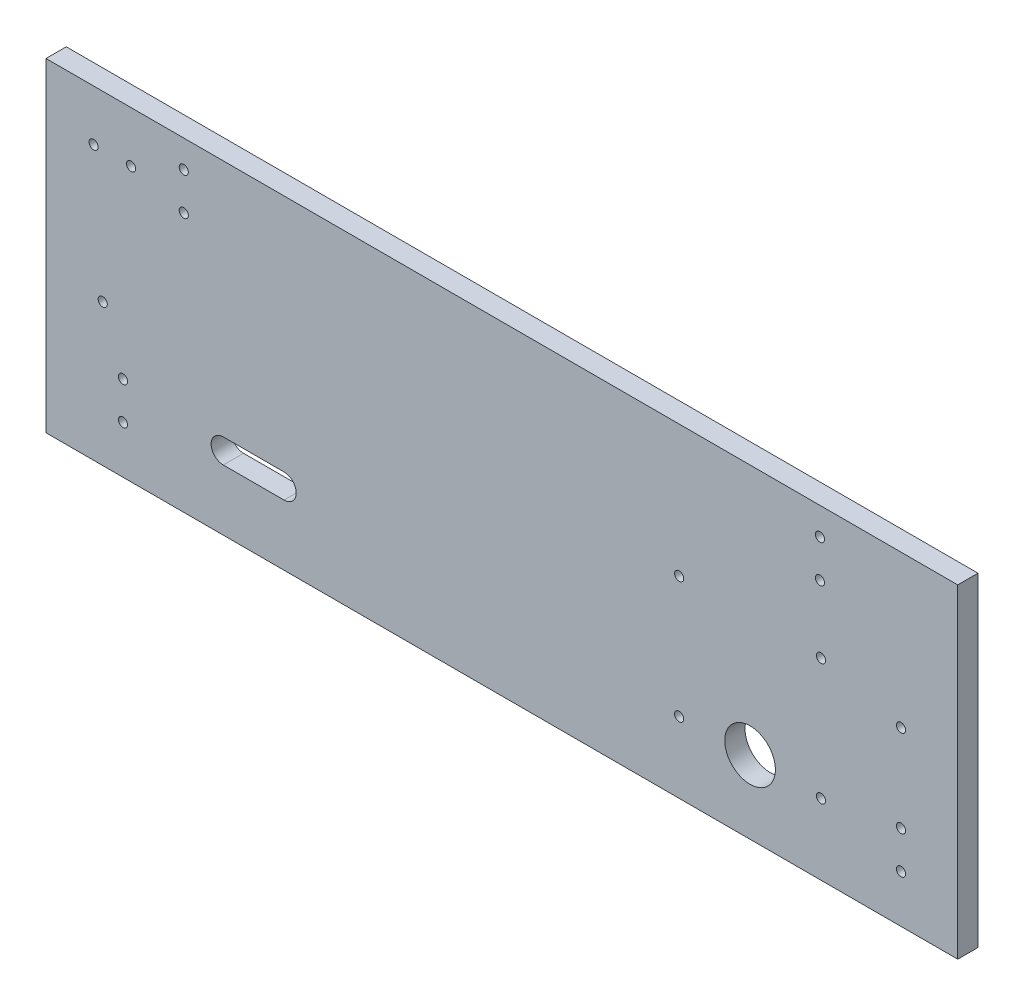
ISO-10303-21;
HEADER;
FILE_DESCRIPTION(('STEP AP214'),'2;1');
FILE_NAME('part.step','',(''),(''),'','','');
FILE_SCHEMA(('AUTOMOTIVE_DESIGN { 1 0 10303 214 1 1 1 1 }'));
ENDSEC;
DATA;
#1=APPLICATION_CONTEXT('core data for automotive mechanical design processes');
#2=APPLICATION_PROTOCOL_DEFINITION('international standard','automotive_design',2000,#1);
#3=PRODUCT_CONTEXT('',#1,'mechanical');
#4=PRODUCT('Part','Part','',(#3));
#5=PRODUCT_RELATED_PRODUCT_CATEGORY('part','',(#4));
#6=PRODUCT_DEFINITION_FORMATION('','',#4);
#7=PRODUCT_DEFINITION_CONTEXT('part definition',#1,'design');
#8=PRODUCT_DEFINITION('design','',#6,#7);
#9=PRODUCT_DEFINITION_SHAPE('','',#8);
#10=(LENGTH_UNIT() NAMED_UNIT(*) SI_UNIT(.MILLI.,.METRE.));
#11=(NAMED_UNIT(*) PLANE_ANGLE_UNIT() SI_UNIT($,.RADIAN.));
#12=(NAMED_UNIT(*) SI_UNIT($,.STERADIAN.) SOLID_ANGLE_UNIT());
#13=UNCERTAINTY_MEASURE_WITH_UNIT(LENGTH_MEASURE(1.E-05),#10,'distance_accuracy_value','');
#14=(GEOMETRIC_REPRESENTATION_CONTEXT(3) GLOBAL_UNCERTAINTY_ASSIGNED_CONTEXT((#13)) GLOBAL_UNIT_ASSIGNED_CONTEXT((#10,
#11,#12)) REPRESENTATION_CONTEXT('',''));
#15=CARTESIAN_POINT('',(0.,0.,0.));
#16=DIRECTION('',(0.,0.,1.));
#17=DIRECTION('',(1.,0.,0.));
#18=AXIS2_PLACEMENT_3D('',#15,#16,#17);
#19=CARTESIAN_POINT('',(0.,0.,10.));
#20=DIRECTION('',(1.,0.,0.));
#21=DIRECTION('',(0.,0.,-1.));
#22=AXIS2_PLACEMENT_3D('',#19,#20,#21);
#23=PLANE('',#22);
#24=DIRECTION('',(0.,-1.,0.));
#25=VECTOR('',#24,1.);
#26=CARTESIAN_POINT('',(0.,0.,0.));
#27=LINE('',#26,#25);
#28=CARTESIAN_POINT('',(0.,160.,0.));
#29=VERTEX_POINT('',#28);
#30=CARTESIAN_POINT('',(0.,0.,0.));
#31=VERTEX_POINT('',#30);
#32=EDGE_CURVE('E158',#29,#31,#27,.T.);
#33=ORIENTED_EDGE('',*,*,#32,.T.);
#34=DIRECTION('',(0.,0.,-1.));
#35=VECTOR('',#34,1.);
#36=CARTESIAN_POINT('',(0.,0.,10.));
#37=LINE('',#36,#35);
#38=CARTESIAN_POINT('',(0.,0.,10.));
#39=VERTEX_POINT('',#38);
#40=EDGE_CURVE('E11',#39,#31,#37,.T.);
#41=ORIENTED_EDGE('',*,*,#40,.F.);
#42=DIRECTION('',(0.,-1.,0.));
#43=VECTOR('',#42,1.);
#44=CARTESIAN_POINT('',(0.,0.,10.));
#45=LINE('',#44,#43);
#46=CARTESIAN_POINT('',(0.,160.,10.));
#47=VERTEX_POINT('',#46);
#48=EDGE_CURVE('E160',#47,#39,#45,.T.);
#49=ORIENTED_EDGE('',*,*,#48,.F.);
#50=DIRECTION('',(0.,0.,-1.));
#51=VECTOR('',#50,1.);
#52=CARTESIAN_POINT('',(0.,160.,10.));
#53=LINE('',#52,#51);
#54=EDGE_CURVE('E170',#47,#29,#53,.T.);
#55=ORIENTED_EDGE('',*,*,#54,.T.);
#56=EDGE_LOOP('',(#33,#41,#49,#55));
#57=FACE_BOUND('',#56,.T.);
#58=ADVANCED_FACE('F37',(#57),#23,.F.);
#59=CARTESIAN_POINT('',(0.,0.,10.));
#60=DIRECTION('',(0.,1.,0.));
#61=DIRECTION('',(0.,0.,1.));
#62=AXIS2_PLACEMENT_3D('',#59,#60,#61);
#63=PLANE('',#62);
#64=DIRECTION('',(1.,0.,0.));
#65=VECTOR('',#64,1.);
#66=CARTESIAN_POINT('',(0.,0.,0.));
#67=LINE('',#66,#65);
#68=CARTESIAN_POINT('',(450.,0.,0.));
#69=VERTEX_POINT('',#68);
#70=EDGE_CURVE('E173',#31,#69,#67,.T.);
#71=ORIENTED_EDGE('',*,*,#70,.T.);
#72=DIRECTION('',(0.,0.,-1.));
#73=VECTOR('',#72,1.);
#74=CARTESIAN_POINT('',(450.,0.,10.));
#75=LINE('',#74,#73);
#76=CARTESIAN_POINT('',(450.,0.,10.));
#77=VERTEX_POINT('',#76);
#78=EDGE_CURVE('E44',#77,#69,#75,.T.);
#79=ORIENTED_EDGE('',*,*,#78,.F.);
#80=DIRECTION('',(1.,0.,0.));
#81=VECTOR('',#80,1.);
#82=CARTESIAN_POINT('',(0.,0.,10.));
#83=LINE('',#82,#81);
#84=EDGE_CURVE('E163',#39,#77,#83,.T.);
#85=ORIENTED_EDGE('',*,*,#84,.F.);
#86=ORIENTED_EDGE('',*,*,#40,.T.);
#87=EDGE_LOOP('',(#71,#79,#85,#86));
#88=FACE_BOUND('',#87,.T.);
#89=ADVANCED_FACE('F202',(#88),#63,.F.);
#90=CARTESIAN_POINT('',(450.,0.,10.));
#91=DIRECTION('',(-1.,0.,0.));
#92=DIRECTION('',(0.,0.,1.));
#93=AXIS2_PLACEMENT_3D('',#90,#91,#92);
#94=PLANE('',#93);
#95=DIRECTION('',(0.,1.,0.));
#96=VECTOR('',#95,1.);
#97=CARTESIAN_POINT('',(450.,0.,0.));
#98=LINE('',#97,#96);
#99=CARTESIAN_POINT('',(450.,160.,0.));
#100=VERTEX_POINT('',#99);
#101=EDGE_CURVE('E175',#69,#100,#98,.T.);
#102=ORIENTED_EDGE('',*,*,#101,.T.);
#103=DIRECTION('',(0.,0.,-1.));
#104=VECTOR('',#103,1.);
#105=CARTESIAN_POINT('',(450.,160.,10.));
#106=LINE('',#105,#104);
#107=CARTESIAN_POINT('',(450.,160.,10.));
#108=VERTEX_POINT('',#107);
#109=EDGE_CURVE('E180',#108,#100,#106,.T.);
#110=ORIENTED_EDGE('',*,*,#109,.F.);
#111=DIRECTION('',(0.,1.,0.));
#112=VECTOR('',#111,1.);
#113=CARTESIAN_POINT('',(450.,0.,10.));
#114=LINE('',#113,#112);
#115=EDGE_CURVE('E166',#77,#108,#114,.T.);
#116=ORIENTED_EDGE('',*,*,#115,.F.);
#117=ORIENTED_EDGE('',*,*,#78,.T.);
#118=EDGE_LOOP('',(#102,#110,#116,#117));
#119=FACE_BOUND('',#118,.T.);
#120=ADVANCED_FACE('F187',(#119),#94,.F.);
#121=CARTESIAN_POINT('',(0.,160.,10.));
#122=DIRECTION('',(0.,-1.,0.));
#123=DIRECTION('',(0.,0.,-1.));
#124=AXIS2_PLACEMENT_3D('',#121,#122,#123);
#125=PLANE('',#124);
#126=DIRECTION('',(-1.,0.,0.));
#127=VECTOR('',#126,1.);
#128=CARTESIAN_POINT('',(0.,160.,0.));
#129=LINE('',#128,#127);
#130=EDGE_CURVE('E164',#100,#29,#129,.T.);
#131=ORIENTED_EDGE('',*,*,#130,.T.);
#132=ORIENTED_EDGE('',*,*,#54,.F.);
#133=DIRECTION('',(-1.,0.,0.));
#134=VECTOR('',#133,1.);
#135=CARTESIAN_POINT('',(0.,160.,10.));
#136=LINE('',#135,#134);
#137=EDGE_CURVE('E168',#108,#47,#136,.T.);
#138=ORIENTED_EDGE('',*,*,#137,.F.);
#139=ORIENTED_EDGE('',*,*,#109,.T.);
#140=EDGE_LOOP('',(#131,#132,#138,#139));
#141=FACE_BOUND('',#140,.T.);
#142=ADVANCED_FACE('F196',(#141),#125,.F.);
#143=CARTESIAN_POINT('',(0.,0.,10.));
#144=DIRECTION('',(0.,0.,-1.));
#145=DIRECTION('',(-1.,0.,0.));
#146=AXIS2_PLACEMENT_3D('',#143,#144,#145);
#147=PLANE('',#146);
#148=CARTESIAN_POINT('',(68.0000000000001,146.5,10.));
#149=DIRECTION('',(0.,0.,1.));
#150=DIRECTION('',(1.,0.,0.));
#151=AXIS2_PLACEMENT_3D('',#148,#149,#150);
#152=CIRCLE('',#151,2.25);
#153=CARTESIAN_POINT('',(70.2500000000001,146.5,10.));
#154=VERTEX_POINT('',#153);
#155=EDGE_CURVE('E341',#154,#154,#152,.T.);
#156=ORIENTED_EDGE('',*,*,#155,.F.);
#157=EDGE_LOOP('',(#156));
#158=FACE_BOUND('',#157,.T.);
#159=CARTESIAN_POINT('',(382.,128.,10.));
#160=DIRECTION('',(0.,0.,1.));
#161=DIRECTION('',(1.,0.,0.));
#162=AXIS2_PLACEMENT_3D('',#159,#160,#161);
#163=CIRCLE('',#162,2.24999999999996);
#164=CARTESIAN_POINT('',(384.25,128.,10.));
#165=VERTEX_POINT('',#164);
#166=EDGE_CURVE('E334',#165,#165,#163,.T.);
#167=ORIENTED_EDGE('',*,*,#166,.F.);
#168=EDGE_LOOP('',(#167));
#169=FACE_BOUND('',#168,.T.);
#170=CARTESIAN_POINT('',(382.,146.5,10.));
#171=DIRECTION('',(0.,0.,1.));
#172=DIRECTION('',(1.,0.,0.));
#173=AXIS2_PLACEMENT_3D('',#170,#171,#172);
#174=CIRCLE('',#173,2.24999999999996);
#175=CARTESIAN_POINT('',(384.25,146.5,10.));
#176=VERTEX_POINT('',#175);
#177=EDGE_CURVE('E353',#176,#176,#174,.T.);
#178=ORIENTED_EDGE('',*,*,#177,.F.);
#179=EDGE_LOOP('',(#178));
#180=FACE_BOUND('',#179,.T.);
#181=CARTESIAN_POINT('',(422.,84.9999999999999,10.));
#182=DIRECTION('',(0.,0.,1.));
#183=DIRECTION('',(1.,0.,0.));
#184=AXIS2_PLACEMENT_3D('',#181,#182,#183);
#185=CIRCLE('',#184,2.24999999999995);
#186=CARTESIAN_POINT('',(424.25,84.9999999999999,10.));
#187=VERTEX_POINT('',#186);
#188=EDGE_CURVE('E346',#187,#187,#185,.T.);
#189=ORIENTED_EDGE('',*,*,#188,.F.);
#190=EDGE_LOOP('',(#189));
#191=FACE_BOUND('',#190,.T.);
#192=CARTESIAN_POINT('',(68.0000000000001,128.,10.));
#193=DIRECTION('',(0.,0.,1.));
#194=DIRECTION('',(1.,0.,0.));
#195=AXIS2_PLACEMENT_3D('',#192,#193,#194);
#196=CIRCLE('',#195,2.25);
#197=CARTESIAN_POINT('',(70.2500000000001,128.,10.));
#198=VERTEX_POINT('',#197);
#199=EDGE_CURVE('E313',#198,#198,#196,.T.);
#200=ORIENTED_EDGE('',*,*,#199,.F.);
#201=EDGE_LOOP('',(#200));
#202=FACE_BOUND('',#201,.T.);
#203=CARTESIAN_POINT('',(38.,42.,10.));
#204=DIRECTION('',(0.,0.,1.));
#205=DIRECTION('',(1.,0.,0.));
#206=AXIS2_PLACEMENT_3D('',#203,#204,#205);
#207=CIRCLE('',#206,2.25);
#208=CARTESIAN_POINT('',(40.25,42.,10.));
#209=VERTEX_POINT('',#208);
#210=EDGE_CURVE('E320',#209,#209,#207,.T.);
#211=ORIENTED_EDGE('',*,*,#210,.F.);
#212=EDGE_LOOP('',(#211));
#213=FACE_BOUND('',#212,.T.);
#214=CARTESIAN_POINT('',(38.,23.5,10.));
#215=DIRECTION('',(0.,0.,1.));
#216=DIRECTION('',(1.,0.,0.));
#217=AXIS2_PLACEMENT_3D('',#214,#215,#216);
#218=CIRCLE('',#217,2.25);
#219=CARTESIAN_POINT('',(40.25,23.5,10.));
#220=VERTEX_POINT('',#219);
#221=EDGE_CURVE('E326',#220,#220,#218,.T.);
#222=ORIENTED_EDGE('',*,*,#221,.F.);
#223=EDGE_LOOP('',(#222));
#224=FACE_BOUND('',#223,.T.);
#225=CARTESIAN_POINT('',(422.,23.4999999999999,10.));
#226=DIRECTION('',(0.,0.,1.));
#227=DIRECTION('',(1.,0.,0.));
#228=AXIS2_PLACEMENT_3D('',#225,#226,#227);
#229=CIRCLE('',#228,2.24999999999995);
#230=CARTESIAN_POINT('',(424.25,23.4999999999999,10.));
#231=VERTEX_POINT('',#230);
#232=EDGE_CURVE('E309',#231,#231,#229,.T.);
#233=ORIENTED_EDGE('',*,*,#232,.F.);
#234=EDGE_LOOP('',(#233));
#235=FACE_BOUND('',#234,.T.);
#236=DIRECTION('',(1.,0.,0.));
#237=VECTOR('',#236,1.);
#238=CARTESIAN_POINT('',(87.5,30.,10.));
#239=LINE('',#238,#237);
#240=CARTESIAN_POINT('',(87.5,30.,10.));
#241=VERTEX_POINT('',#240);
#242=CARTESIAN_POINT('',(117.5,30.,10.));
#243=VERTEX_POINT('',#242);
#244=EDGE_CURVE('E122',#241,#243,#239,.T.);
#245=ORIENTED_EDGE('',*,*,#244,.F.);
#246=CARTESIAN_POINT('',(87.5,36.,10.));
#247=DIRECTION('',(0.,0.,1.));
#248=DIRECTION('',(1.,0.,0.));
#249=AXIS2_PLACEMENT_3D('',#246,#247,#248);
#250=CIRCLE('',#249,6.);
#251=CARTESIAN_POINT('',(87.5,42.,10.));
#252=VERTEX_POINT('',#251);
#253=EDGE_CURVE('E51',#252,#241,#250,.T.);
#254=ORIENTED_EDGE('',*,*,#253,.F.);
#255=DIRECTION('',(-1.,0.,0.));
#256=VECTOR('',#255,1.);
#257=CARTESIAN_POINT('',(87.5,42.,10.));
#258=LINE('',#257,#256);
#259=CARTESIAN_POINT('',(117.5,42.,10.));
#260=VERTEX_POINT('',#259);
#261=EDGE_CURVE('E111',#260,#252,#258,.T.);
#262=ORIENTED_EDGE('',*,*,#261,.F.);
#263=CARTESIAN_POINT('',(117.5,36.,10.));
#264=DIRECTION('',(0.,0.,1.));
#265=DIRECTION('',(1.,0.,0.));
#266=AXIS2_PLACEMENT_3D('',#263,#264,#265);
#267=CIRCLE('',#266,6.);
#268=EDGE_CURVE('E116',#243,#260,#267,.T.);
#269=ORIENTED_EDGE('',*,*,#268,.F.);
#270=EDGE_LOOP('',(#245,#254,#262,#269));
#271=FACE_BOUND('',#270,.T.);
#272=CARTESIAN_POINT('',(312.5,94.9999999999998,10.));
#273=DIRECTION('',(0.,0.,1.));
#274=DIRECTION('',(1.,0.,0.));
#275=AXIS2_PLACEMENT_3D('',#272,#273,#274);
#276=CIRCLE('',#275,2.24999999999995);
#277=CARTESIAN_POINT('',(314.75,94.9999999999998,10.));
#278=VERTEX_POINT('',#277);
#279=EDGE_CURVE('E108',#278,#278,#276,.T.);
#280=ORIENTED_EDGE('',*,*,#279,.F.);
#281=EDGE_LOOP('',(#280));
#282=FACE_BOUND('',#281,.T.);
#283=CARTESIAN_POINT('',(382.5,94.9999999999998,10.));
#284=DIRECTION('',(0.,0.,1.));
#285=DIRECTION('',(1.,0.,0.));
#286=AXIS2_PLACEMENT_3D('',#283,#284,#285);
#287=CIRCLE('',#286,2.25000000000001);
#288=CARTESIAN_POINT('',(384.75,94.9999999999998,10.));
#289=VERTEX_POINT('',#288);
#290=EDGE_CURVE('E144',#289,#289,#287,.T.);
#291=ORIENTED_EDGE('',*,*,#290,.F.);
#292=EDGE_LOOP('',(#291));
#293=FACE_BOUND('',#292,.T.);
#294=CARTESIAN_POINT('',(382.5,34.9999999999998,10.));
#295=DIRECTION('',(0.,0.,1.));
#296=DIRECTION('',(1.,0.,0.));
#297=AXIS2_PLACEMENT_3D('',#294,#295,#296);
#298=CIRCLE('',#297,2.24999999999995);
#299=CARTESIAN_POINT('',(384.75,34.9999999999998,10.));
#300=VERTEX_POINT('',#299);
#301=EDGE_CURVE('E150',#300,#300,#298,.T.);
#302=ORIENTED_EDGE('',*,*,#301,.F.);
#303=EDGE_LOOP('',(#302));
#304=FACE_BOUND('',#303,.T.);
#305=CARTESIAN_POINT('',(28.0000000000001,70.,10.));
#306=DIRECTION('',(0.,0.,1.));
#307=DIRECTION('',(1.,0.,0.));
#308=AXIS2_PLACEMENT_3D('',#305,#306,#307);
#309=CIRCLE('',#308,2.25);
#310=CARTESIAN_POINT('',(30.2500000000001,70.,10.));
#311=VERTEX_POINT('',#310);
#312=EDGE_CURVE('E365',#311,#311,#309,.T.);
#313=ORIENTED_EDGE('',*,*,#312,.F.);
#314=EDGE_LOOP('',(#313));
#315=FACE_BOUND('',#314,.T.);
#316=CARTESIAN_POINT('',(42.,134.933694221876,10.));
#317=DIRECTION('',(0.,0.,1.));
#318=DIRECTION('',(1.,0.,0.));
#319=AXIS2_PLACEMENT_3D('',#316,#317,#318);
#320=CIRCLE('',#319,2.25);
#321=CARTESIAN_POINT('',(44.25,134.933694221876,10.));
#322=VERTEX_POINT('',#321);
#323=EDGE_CURVE('E358',#322,#322,#320,.T.);
#324=ORIENTED_EDGE('',*,*,#323,.F.);
#325=EDGE_LOOP('',(#324));
#326=FACE_BOUND('',#325,.T.);
#327=CARTESIAN_POINT('',(23.5,134.933694221876,10.));
#328=DIRECTION('',(0.,0.,1.));
#329=DIRECTION('',(1.,0.,0.));
#330=AXIS2_PLACEMENT_3D('',#327,#328,#329);
#331=CIRCLE('',#330,2.25);
#332=CARTESIAN_POINT('',(25.75,134.933694221876,10.));
#333=VERTEX_POINT('',#332);
#334=EDGE_CURVE('E375',#333,#333,#331,.T.);
#335=ORIENTED_EDGE('',*,*,#334,.F.);
#336=EDGE_LOOP('',(#335));
#337=FACE_BOUND('',#336,.T.);
#338=CARTESIAN_POINT('',(312.5,34.9999999999998,10.));
#339=DIRECTION('',(0.,0.,1.));
#340=DIRECTION('',(1.,0.,0.));
#341=AXIS2_PLACEMENT_3D('',#338,#339,#340);
#342=CIRCLE('',#341,2.24999999999995);
#343=CARTESIAN_POINT('',(314.75,34.9999999999998,10.));
#344=VERTEX_POINT('',#343);
#345=EDGE_CURVE('E156',#344,#344,#342,.T.);
#346=ORIENTED_EDGE('',*,*,#345,.F.);
#347=EDGE_LOOP('',(#346));
#348=FACE_BOUND('',#347,.T.);
#349=CARTESIAN_POINT('',(422.,41.9999999999999,10.));
#350=DIRECTION('',(0.,0.,1.));
#351=DIRECTION('',(1.,0.,0.));
#352=AXIS2_PLACEMENT_3D('',#349,#350,#351);
#353=CIRCLE('',#352,2.24999999999995);
#354=CARTESIAN_POINT('',(424.25,41.9999999999999,10.));
#355=VERTEX_POINT('',#354);
#356=EDGE_CURVE('E304',#355,#355,#353,.T.);
#357=ORIENTED_EDGE('',*,*,#356,.F.);
#358=EDGE_LOOP('',(#357));
#359=FACE_BOUND('',#358,.T.);
#360=CARTESIAN_POINT('',(347.5,36.,10.));
#361=DIRECTION('',(0.,0.,1.));
#362=DIRECTION('',(1.,0.,0.));
#363=AXIS2_PLACEMENT_3D('',#360,#361,#362);
#364=CIRCLE('',#363,12.5);
#365=CARTESIAN_POINT('',(360.,36.,10.));
#366=VERTEX_POINT('',#365);
#367=EDGE_CURVE('E123',#366,#366,#364,.T.);
#368=ORIENTED_EDGE('',*,*,#367,.F.);
#369=EDGE_LOOP('',(#368));
#370=FACE_BOUND('',#369,.T.);
#371=ORIENTED_EDGE('',*,*,#48,.T.);
#372=ORIENTED_EDGE('',*,*,#84,.T.);
#373=ORIENTED_EDGE('',*,*,#115,.T.);
#374=ORIENTED_EDGE('',*,*,#137,.T.);
#375=EDGE_LOOP('',(#371,#372,#373,#374));
#376=FACE_BOUND('',#375,.T.);
#377=ADVANCED_FACE('F119',(#158,#169,#180,#191,#202,#213,#224,#235,#271,#282,#293,#304,#315,
#326,#337,#348,#359,#370,#376),#147,.F.);
#378=CARTESIAN_POINT('',(0.,0.,0.));
#379=DIRECTION('',(0.,0.,-1.));
#380=DIRECTION('',(-1.,0.,0.));
#381=AXIS2_PLACEMENT_3D('',#378,#379,#380);
#382=PLANE('',#381);
#383=CARTESIAN_POINT('',(68.0000000000001,146.5,0.));
#384=DIRECTION('',(0.,0.,1.));
#385=DIRECTION('',(1.,0.,0.));
#386=AXIS2_PLACEMENT_3D('',#383,#384,#385);
#387=CIRCLE('',#386,2.25);
#388=CARTESIAN_POINT('',(70.2500000000001,146.5,0.));
#389=VERTEX_POINT('',#388);
#390=EDGE_CURVE('E316',#389,#389,#387,.T.);
#391=ORIENTED_EDGE('',*,*,#390,.T.);
#392=EDGE_LOOP('',(#391));
#393=FACE_BOUND('',#392,.T.);
#394=CARTESIAN_POINT('',(382.,128.,0.));
#395=DIRECTION('',(0.,0.,1.));
#396=DIRECTION('',(1.,0.,0.));
#397=AXIS2_PLACEMENT_3D('',#394,#395,#396);
#398=CIRCLE('',#397,2.24999999999996);
#399=CARTESIAN_POINT('',(384.25,128.,0.));
#400=VERTEX_POINT('',#399);
#401=EDGE_CURVE('E338',#400,#400,#398,.T.);
#402=ORIENTED_EDGE('',*,*,#401,.T.);
#403=EDGE_LOOP('',(#402));
#404=FACE_BOUND('',#403,.T.);
#405=CARTESIAN_POINT('',(382.,146.5,0.));
#406=DIRECTION('',(0.,0.,1.));
#407=DIRECTION('',(1.,0.,0.));
#408=AXIS2_PLACEMENT_3D('',#405,#406,#407);
#409=CIRCLE('',#408,2.24999999999996);
#410=CARTESIAN_POINT('',(384.25,146.5,0.));
#411=VERTEX_POINT('',#410);
#412=EDGE_CURVE('E337',#411,#411,#409,.T.);
#413=ORIENTED_EDGE('',*,*,#412,.T.);
#414=EDGE_LOOP('',(#413));
#415=FACE_BOUND('',#414,.T.);
#416=CARTESIAN_POINT('',(422.,84.9999999999999,0.));
#417=DIRECTION('',(0.,0.,1.));
#418=DIRECTION('',(1.,0.,0.));
#419=AXIS2_PLACEMENT_3D('',#416,#417,#418);
#420=CIRCLE('',#419,2.24999999999995);
#421=CARTESIAN_POINT('',(424.25,84.9999999999999,0.));
#422=VERTEX_POINT('',#421);
#423=EDGE_CURVE('E350',#422,#422,#420,.T.);
#424=ORIENTED_EDGE('',*,*,#423,.T.);
#425=EDGE_LOOP('',(#424));
#426=FACE_BOUND('',#425,.T.);
#427=CARTESIAN_POINT('',(68.0000000000001,128.,0.));
#428=DIRECTION('',(0.,0.,1.));
#429=DIRECTION('',(1.,0.,0.));
#430=AXIS2_PLACEMENT_3D('',#427,#428,#429);
#431=CIRCLE('',#430,2.25);
#432=CARTESIAN_POINT('',(70.2500000000001,128.,0.));
#433=VERTEX_POINT('',#432);
#434=EDGE_CURVE('E317',#433,#433,#431,.T.);
#435=ORIENTED_EDGE('',*,*,#434,.T.);
#436=EDGE_LOOP('',(#435));
#437=FACE_BOUND('',#436,.T.);
#438=CARTESIAN_POINT('',(38.,42.,0.));
#439=DIRECTION('',(0.,0.,1.));
#440=DIRECTION('',(1.,0.,0.));
#441=AXIS2_PLACEMENT_3D('',#438,#439,#440);
#442=CIRCLE('',#441,2.25);
#443=CARTESIAN_POINT('',(40.25,42.,0.));
#444=VERTEX_POINT('',#443);
#445=EDGE_CURVE('E323',#444,#444,#442,.T.);
#446=ORIENTED_EDGE('',*,*,#445,.T.);
#447=EDGE_LOOP('',(#446));
#448=FACE_BOUND('',#447,.T.);
#449=CARTESIAN_POINT('',(38.,23.5,0.));
#450=DIRECTION('',(0.,0.,1.));
#451=DIRECTION('',(1.,0.,0.));
#452=AXIS2_PLACEMENT_3D('',#449,#450,#451);
#453=CIRCLE('',#452,2.25);
#454=CARTESIAN_POINT('',(40.25,23.5,0.));
#455=VERTEX_POINT('',#454);
#456=EDGE_CURVE('E329',#455,#455,#453,.T.);
#457=ORIENTED_EDGE('',*,*,#456,.T.);
#458=EDGE_LOOP('',(#457));
#459=FACE_BOUND('',#458,.T.);
#460=CARTESIAN_POINT('',(422.,23.4999999999999,0.));
#461=DIRECTION('',(0.,0.,1.));
#462=DIRECTION('',(1.,0.,0.));
#463=AXIS2_PLACEMENT_3D('',#460,#461,#462);
#464=CIRCLE('',#463,2.24999999999995);
#465=CARTESIAN_POINT('',(424.25,23.4999999999999,0.));
#466=VERTEX_POINT('',#465);
#467=EDGE_CURVE('E306',#466,#466,#464,.T.);
#468=ORIENTED_EDGE('',*,*,#467,.T.);
#469=EDGE_LOOP('',(#468));
#470=FACE_BOUND('',#469,.T.);
#471=CARTESIAN_POINT('',(87.5,36.,0.));
#472=DIRECTION('',(0.,0.,1.));
#473=DIRECTION('',(1.,0.,0.));
#474=AXIS2_PLACEMENT_3D('',#471,#472,#473);
#475=CIRCLE('',#474,6.);
#476=CARTESIAN_POINT('',(87.5,42.,0.));
#477=VERTEX_POINT('',#476);
#478=CARTESIAN_POINT('',(87.5,30.,0.));
#479=VERTEX_POINT('',#478);
#480=EDGE_CURVE('E103',#477,#479,#475,.T.);
#481=ORIENTED_EDGE('',*,*,#480,.T.);
#482=DIRECTION('',(1.,0.,0.));
#483=VECTOR('',#482,1.);
#484=CARTESIAN_POINT('',(87.5,30.,0.));
#485=LINE('',#484,#483);
#486=CARTESIAN_POINT('',(117.5,30.,0.));
#487=VERTEX_POINT('',#486);
#488=EDGE_CURVE('E135',#479,#487,#485,.T.);
#489=ORIENTED_EDGE('',*,*,#488,.T.);
#490=CARTESIAN_POINT('',(117.5,36.,0.));
#491=DIRECTION('',(0.,0.,1.));
#492=DIRECTION('',(1.,0.,0.));
#493=AXIS2_PLACEMENT_3D('',#490,#491,#492);
#494=CIRCLE('',#493,6.);
#495=CARTESIAN_POINT('',(117.5,42.,0.));
#496=VERTEX_POINT('',#495);
#497=EDGE_CURVE('E59',#487,#496,#494,.T.);
#498=ORIENTED_EDGE('',*,*,#497,.T.);
#499=DIRECTION('',(-1.,0.,0.));
#500=VECTOR('',#499,1.);
#501=CARTESIAN_POINT('',(87.5,42.,0.));
#502=LINE('',#501,#500);
#503=EDGE_CURVE('E131',#496,#477,#502,.T.);
#504=ORIENTED_EDGE('',*,*,#503,.T.);
#505=EDGE_LOOP('',(#481,#489,#498,#504));
#506=FACE_BOUND('',#505,.T.);
#507=CARTESIAN_POINT('',(312.5,94.9999999999998,0.));
#508=DIRECTION('',(0.,0.,1.));
#509=DIRECTION('',(1.,0.,0.));
#510=AXIS2_PLACEMENT_3D('',#507,#508,#509);
#511=CIRCLE('',#510,2.24999999999995);
#512=CARTESIAN_POINT('',(314.75,94.9999999999998,0.));
#513=VERTEX_POINT('',#512);
#514=EDGE_CURVE('E141',#513,#513,#511,.T.);
#515=ORIENTED_EDGE('',*,*,#514,.T.);
#516=EDGE_LOOP('',(#515));
#517=FACE_BOUND('',#516,.T.);
#518=CARTESIAN_POINT('',(382.5,94.9999999999998,0.));
#519=DIRECTION('',(0.,0.,1.));
#520=DIRECTION('',(1.,0.,0.));
#521=AXIS2_PLACEMENT_3D('',#518,#519,#520);
#522=CIRCLE('',#521,2.25000000000001);
#523=CARTESIAN_POINT('',(384.75,94.9999999999998,0.));
#524=VERTEX_POINT('',#523);
#525=EDGE_CURVE('E147',#524,#524,#522,.T.);
#526=ORIENTED_EDGE('',*,*,#525,.T.);
#527=EDGE_LOOP('',(#526));
#528=FACE_BOUND('',#527,.T.);
#529=CARTESIAN_POINT('',(382.5,34.9999999999998,0.));
#530=DIRECTION('',(0.,0.,1.));
#531=DIRECTION('',(1.,0.,0.));
#532=AXIS2_PLACEMENT_3D('',#529,#530,#531);
#533=CIRCLE('',#532,2.24999999999995);
#534=CARTESIAN_POINT('',(384.75,34.9999999999998,0.));
#535=VERTEX_POINT('',#534);
#536=EDGE_CURVE('E153',#535,#535,#533,.T.);
#537=ORIENTED_EDGE('',*,*,#536,.T.);
#538=EDGE_LOOP('',(#537));
#539=FACE_BOUND('',#538,.T.);
#540=CARTESIAN_POINT('',(28.0000000000001,70.,0.));
#541=DIRECTION('',(0.,0.,1.));
#542=DIRECTION('',(1.,0.,0.));
#543=AXIS2_PLACEMENT_3D('',#540,#541,#542);
#544=CIRCLE('',#543,2.25);
#545=CARTESIAN_POINT('',(30.2500000000001,70.,0.));
#546=VERTEX_POINT('',#545);
#547=EDGE_CURVE('E349',#546,#546,#544,.T.);
#548=ORIENTED_EDGE('',*,*,#547,.T.);
#549=EDGE_LOOP('',(#548));
#550=FACE_BOUND('',#549,.T.);
#551=CARTESIAN_POINT('',(42.,134.933694221876,0.));
#552=DIRECTION('',(0.,0.,1.));
#553=DIRECTION('',(1.,0.,0.));
#554=AXIS2_PLACEMENT_3D('',#551,#552,#553);
#555=CIRCLE('',#554,2.25);
#556=CARTESIAN_POINT('',(44.25,134.933694221876,0.));
#557=VERTEX_POINT('',#556);
#558=EDGE_CURVE('E362',#557,#557,#555,.T.);
#559=ORIENTED_EDGE('',*,*,#558,.T.);
#560=EDGE_LOOP('',(#559));
#561=FACE_BOUND('',#560,.T.);
#562=CARTESIAN_POINT('',(23.5,134.933694221876,0.));
#563=DIRECTION('',(0.,0.,1.));
#564=DIRECTION('',(1.,0.,0.));
#565=AXIS2_PLACEMENT_3D('',#562,#563,#564);
#566=CIRCLE('',#565,2.25);
#567=CARTESIAN_POINT('',(25.75,134.933694221876,0.));
#568=VERTEX_POINT('',#567);
#569=EDGE_CURVE('E361',#568,#568,#566,.T.);
#570=ORIENTED_EDGE('',*,*,#569,.T.);
#571=EDGE_LOOP('',(#570));
#572=FACE_BOUND('',#571,.T.);
#573=CARTESIAN_POINT('',(312.5,34.9999999999998,0.));
#574=DIRECTION('',(0.,0.,1.));
#575=DIRECTION('',(1.,0.,0.));
#576=AXIS2_PLACEMENT_3D('',#573,#574,#575);
#577=CIRCLE('',#576,2.24999999999995);
#578=CARTESIAN_POINT('',(314.75,34.9999999999998,0.));
#579=VERTEX_POINT('',#578);
#580=EDGE_CURVE('E372',#579,#579,#577,.T.);
#581=ORIENTED_EDGE('',*,*,#580,.T.);
#582=EDGE_LOOP('',(#581));
#583=FACE_BOUND('',#582,.T.);
#584=CARTESIAN_POINT('',(422.,41.9999999999999,0.));
#585=DIRECTION('',(0.,0.,1.));
#586=DIRECTION('',(1.,0.,0.));
#587=AXIS2_PLACEMENT_3D('',#584,#585,#586);
#588=CIRCLE('',#587,2.24999999999995);
#589=CARTESIAN_POINT('',(424.25,41.9999999999999,0.));
#590=VERTEX_POINT('',#589);
#591=EDGE_CURVE('E301',#590,#590,#588,.T.);
#592=ORIENTED_EDGE('',*,*,#591,.T.);
#593=EDGE_LOOP('',(#592));
#594=FACE_BOUND('',#593,.T.);
#595=CARTESIAN_POINT('',(347.5,36.,0.));
#596=DIRECTION('',(0.,0.,1.));
#597=DIRECTION('',(1.,0.,0.));
#598=AXIS2_PLACEMENT_3D('',#595,#596,#597);
#599=CIRCLE('',#598,12.5);
#600=CARTESIAN_POINT('',(360.,36.,0.));
#601=VERTEX_POINT('',#600);
#602=EDGE_CURVE('E126',#601,#601,#599,.T.);
#603=ORIENTED_EDGE('',*,*,#602,.T.);
#604=EDGE_LOOP('',(#603));
#605=FACE_BOUND('',#604,.T.);
#606=ORIENTED_EDGE('',*,*,#32,.F.);
#607=ORIENTED_EDGE('',*,*,#130,.F.);
#608=ORIENTED_EDGE('',*,*,#101,.F.);
#609=ORIENTED_EDGE('',*,*,#70,.F.);
#610=EDGE_LOOP('',(#606,#607,#608,#609));
#611=FACE_BOUND('',#610,.T.);
#612=ADVANCED_FACE('F193',(#393,#404,#415,#426,#437,#448,#459,#470,#506,#517,#528,#539,#550,
#561,#572,#583,#594,#605,#611),#382,.T.);
#613=CARTESIAN_POINT('',(347.5,36.,0.));
#614=DIRECTION('',(0.,0.,1.));
#615=DIRECTION('',(1.,0.,0.));
#616=AXIS2_PLACEMENT_3D('',#613,#614,#615);
#617=CYLINDRICAL_SURFACE('',#616,12.5);
#618=ORIENTED_EDGE('',*,*,#602,.F.);
#619=EDGE_LOOP('',(#618));
#620=FACE_BOUND('',#619,.T.);
#621=ORIENTED_EDGE('',*,*,#367,.T.);
#622=EDGE_LOOP('',(#621));
#623=FACE_BOUND('',#622,.T.);
#624=ADVANCED_FACE('F214',(#620,#623),#617,.F.);
#625=CARTESIAN_POINT('',(422.,41.9999999999999,0.));
#626=DIRECTION('',(0.,0.,1.));
#627=DIRECTION('',(1.,0.,0.));
#628=AXIS2_PLACEMENT_3D('',#625,#626,#627);
#629=CYLINDRICAL_SURFACE('',#628,2.24999999999995);
#630=ORIENTED_EDGE('',*,*,#591,.F.);
#631=EDGE_LOOP('',(#630));
#632=FACE_BOUND('',#631,.T.);
#633=ORIENTED_EDGE('',*,*,#356,.T.);
#634=EDGE_LOOP('',(#633));
#635=FACE_BOUND('',#634,.T.);
#636=ADVANCED_FACE('F221',(#632,#635),#629,.F.);
#637=CARTESIAN_POINT('',(312.5,34.9999999999998,0.));
#638=DIRECTION('',(0.,0.,1.));
#639=DIRECTION('',(1.,0.,0.));
#640=AXIS2_PLACEMENT_3D('',#637,#638,#639);
#641=CYLINDRICAL_SURFACE('',#640,2.24999999999995);
#642=ORIENTED_EDGE('',*,*,#580,.F.);
#643=EDGE_LOOP('',(#642));
#644=FACE_BOUND('',#643,.T.);
#645=ORIENTED_EDGE('',*,*,#345,.T.);
#646=EDGE_LOOP('',(#645));
#647=FACE_BOUND('',#646,.T.);
#648=ADVANCED_FACE('F252',(#644,#647),#641,.F.);
#649=CARTESIAN_POINT('',(23.5,134.933694221876,0.));
#650=DIRECTION('',(0.,0.,1.));
#651=DIRECTION('',(1.,0.,0.));
#652=AXIS2_PLACEMENT_3D('',#649,#650,#651);
#653=CYLINDRICAL_SURFACE('',#652,2.25);
#654=ORIENTED_EDGE('',*,*,#569,.F.);
#655=EDGE_LOOP('',(#654));
#656=FACE_BOUND('',#655,.T.);
#657=ORIENTED_EDGE('',*,*,#334,.T.);
#658=EDGE_LOOP('',(#657));
#659=FACE_BOUND('',#658,.T.);
#660=ADVANCED_FACE('F248',(#656,#659),#653,.F.);
#661=CARTESIAN_POINT('',(42.,134.933694221876,0.));
#662=DIRECTION('',(0.,0.,1.));
#663=DIRECTION('',(1.,0.,0.));
#664=AXIS2_PLACEMENT_3D('',#661,#662,#663);
#665=CYLINDRICAL_SURFACE('',#664,2.25);
#666=ORIENTED_EDGE('',*,*,#558,.F.);
#667=EDGE_LOOP('',(#666));
#668=FACE_BOUND('',#667,.T.);
#669=ORIENTED_EDGE('',*,*,#323,.T.);
#670=EDGE_LOOP('',(#669));
#671=FACE_BOUND('',#670,.T.);
#672=ADVANCED_FACE('F251',(#668,#671),#665,.F.);
#673=CARTESIAN_POINT('',(28.0000000000001,70.,0.));
#674=DIRECTION('',(0.,0.,1.));
#675=DIRECTION('',(1.,0.,0.));
#676=AXIS2_PLACEMENT_3D('',#673,#674,#675);
#677=CYLINDRICAL_SURFACE('',#676,2.25);
#678=ORIENTED_EDGE('',*,*,#547,.F.);
#679=EDGE_LOOP('',(#678));
#680=FACE_BOUND('',#679,.T.);
#681=ORIENTED_EDGE('',*,*,#312,.T.);
#682=EDGE_LOOP('',(#681));
#683=FACE_BOUND('',#682,.T.);
#684=ADVANCED_FACE('F227',(#680,#683),#677,.F.);
#685=CARTESIAN_POINT('',(382.5,34.9999999999998,0.));
#686=DIRECTION('',(0.,0.,1.));
#687=DIRECTION('',(1.,0.,0.));
#688=AXIS2_PLACEMENT_3D('',#685,#686,#687);
#689=CYLINDRICAL_SURFACE('',#688,2.24999999999995);
#690=ORIENTED_EDGE('',*,*,#536,.F.);
#691=EDGE_LOOP('',(#690));
#692=FACE_BOUND('',#691,.T.);
#693=ORIENTED_EDGE('',*,*,#301,.T.);
#694=EDGE_LOOP('',(#693));
#695=FACE_BOUND('',#694,.T.);
#696=ADVANCED_FACE('F223',(#692,#695),#689,.F.);
#697=CARTESIAN_POINT('',(382.5,94.9999999999998,0.));
#698=DIRECTION('',(0.,0.,1.));
#699=DIRECTION('',(1.,0.,0.));
#700=AXIS2_PLACEMENT_3D('',#697,#698,#699);
#701=CYLINDRICAL_SURFACE('',#700,2.25000000000001);
#702=ORIENTED_EDGE('',*,*,#525,.F.);
#703=EDGE_LOOP('',(#702));
#704=FACE_BOUND('',#703,.T.);
#705=ORIENTED_EDGE('',*,*,#290,.T.);
#706=EDGE_LOOP('',(#705));
#707=FACE_BOUND('',#706,.T.);
#708=ADVANCED_FACE('F226',(#704,#707),#701,.F.);
#709=CARTESIAN_POINT('',(312.5,94.9999999999998,0.));
#710=DIRECTION('',(0.,0.,1.));
#711=DIRECTION('',(1.,0.,0.));
#712=AXIS2_PLACEMENT_3D('',#709,#710,#711);
#713=CYLINDRICAL_SURFACE('',#712,2.24999999999995);
#714=ORIENTED_EDGE('',*,*,#514,.F.);
#715=EDGE_LOOP('',(#714));
#716=FACE_BOUND('',#715,.T.);
#717=ORIENTED_EDGE('',*,*,#279,.T.);
#718=EDGE_LOOP('',(#717));
#719=FACE_BOUND('',#718,.T.);
#720=ADVANCED_FACE('F231',(#716,#719),#713,.F.);
#721=CARTESIAN_POINT('',(87.5,36.,0.));
#722=DIRECTION('',(0.,0.,1.));
#723=DIRECTION('',(1.,0.,0.));
#724=AXIS2_PLACEMENT_3D('',#721,#722,#723);
#725=CYLINDRICAL_SURFACE('',#724,6.);
#726=ORIENTED_EDGE('',*,*,#253,.T.);
#727=DIRECTION('',(0.,0.,1.));
#728=VECTOR('',#727,1.);
#729=CARTESIAN_POINT('',(87.5,30.,0.));
#730=LINE('',#729,#728);
#731=EDGE_CURVE('E133',#479,#241,#730,.T.);
#732=ORIENTED_EDGE('',*,*,#731,.F.);
#733=ORIENTED_EDGE('',*,*,#480,.F.);
#734=DIRECTION('',(0.,0.,1.));
#735=VECTOR('',#734,1.);
#736=CARTESIAN_POINT('',(87.5,42.,0.));
#737=LINE('',#736,#735);
#738=EDGE_CURVE('E99',#477,#252,#737,.T.);
#739=ORIENTED_EDGE('',*,*,#738,.T.);
#740=EDGE_LOOP('',(#726,#732,#733,#739));
#741=FACE_BOUND('',#740,.T.);
#742=ADVANCED_FACE('F101',(#741),#725,.F.);
#743=CARTESIAN_POINT('',(87.5,42.,0.));
#744=DIRECTION('',(0.,1.,0.));
#745=DIRECTION('',(-1.,0.,0.));
#746=AXIS2_PLACEMENT_3D('',#743,#744,#745);
#747=PLANE('',#746);
#748=ORIENTED_EDGE('',*,*,#261,.T.);
#749=ORIENTED_EDGE('',*,*,#738,.F.);
#750=ORIENTED_EDGE('',*,*,#503,.F.);
#751=DIRECTION('',(0.,0.,1.));
#752=VECTOR('',#751,1.);
#753=CARTESIAN_POINT('',(117.5,42.,0.));
#754=LINE('',#753,#752);
#755=EDGE_CURVE('E107',#496,#260,#754,.T.);
#756=ORIENTED_EDGE('',*,*,#755,.T.);
#757=EDGE_LOOP('',(#748,#749,#750,#756));
#758=FACE_BOUND('',#757,.T.);
#759=ADVANCED_FACE('F112',(#758),#747,.F.);
#760=CARTESIAN_POINT('',(117.5,36.,0.));
#761=DIRECTION('',(0.,0.,1.));
#762=DIRECTION('',(1.,0.,0.));
#763=AXIS2_PLACEMENT_3D('',#760,#761,#762);
#764=CYLINDRICAL_SURFACE('',#763,6.);
#765=ORIENTED_EDGE('',*,*,#268,.T.);
#766=ORIENTED_EDGE('',*,*,#755,.F.);
#767=ORIENTED_EDGE('',*,*,#497,.F.);
#768=DIRECTION('',(0.,0.,1.));
#769=VECTOR('',#768,1.);
#770=CARTESIAN_POINT('',(117.5,30.,0.));
#771=LINE('',#770,#769);
#772=EDGE_CURVE('E381',#487,#243,#771,.T.);
#773=ORIENTED_EDGE('',*,*,#772,.T.);
#774=EDGE_LOOP('',(#765,#766,#767,#773));
#775=FACE_BOUND('',#774,.T.);
#776=ADVANCED_FACE('F238',(#775),#764,.F.);
#777=CARTESIAN_POINT('',(87.5,30.,0.));
#778=DIRECTION('',(0.,-1.,0.));
#779=DIRECTION('',(1.,0.,0.));
#780=AXIS2_PLACEMENT_3D('',#777,#778,#779);
#781=PLANE('',#780);
#782=ORIENTED_EDGE('',*,*,#244,.T.);
#783=ORIENTED_EDGE('',*,*,#772,.F.);
#784=ORIENTED_EDGE('',*,*,#488,.F.);
#785=ORIENTED_EDGE('',*,*,#731,.T.);
#786=EDGE_LOOP('',(#782,#783,#784,#785));
#787=FACE_BOUND('',#786,.T.);
#788=ADVANCED_FACE('F241',(#787),#781,.F.);
#789=CARTESIAN_POINT('',(422.,23.4999999999999,0.));
#790=DIRECTION('',(0.,0.,1.));
#791=DIRECTION('',(1.,0.,0.));
#792=AXIS2_PLACEMENT_3D('',#789,#790,#791);
#793=CYLINDRICAL_SURFACE('',#792,2.24999999999995);
#794=ORIENTED_EDGE('',*,*,#467,.F.);
#795=EDGE_LOOP('',(#794));
#796=FACE_BOUND('',#795,.T.);
#797=ORIENTED_EDGE('',*,*,#232,.T.);
#798=EDGE_LOOP('',(#797));
#799=FACE_BOUND('',#798,.T.);
#800=ADVANCED_FACE('F244',(#796,#799),#793,.F.);
#801=CARTESIAN_POINT('',(38.,23.5,0.));
#802=DIRECTION('',(0.,0.,1.));
#803=DIRECTION('',(1.,0.,0.));
#804=AXIS2_PLACEMENT_3D('',#801,#802,#803);
#805=CYLINDRICAL_SURFACE('',#804,2.25);
#806=ORIENTED_EDGE('',*,*,#456,.F.);
#807=EDGE_LOOP('',(#806));
#808=FACE_BOUND('',#807,.T.);
#809=ORIENTED_EDGE('',*,*,#221,.T.);
#810=EDGE_LOOP('',(#809));
#811=FACE_BOUND('',#810,.T.);
#812=ADVANCED_FACE('F282',(#808,#811),#805,.F.);
#813=CARTESIAN_POINT('',(38.,42.,0.));
#814=DIRECTION('',(0.,0.,1.));
#815=DIRECTION('',(1.,0.,0.));
#816=AXIS2_PLACEMENT_3D('',#813,#814,#815);
#817=CYLINDRICAL_SURFACE('',#816,2.25);
#818=ORIENTED_EDGE('',*,*,#445,.F.);
#819=EDGE_LOOP('',(#818));
#820=FACE_BOUND('',#819,.T.);
#821=ORIENTED_EDGE('',*,*,#210,.T.);
#822=EDGE_LOOP('',(#821));
#823=FACE_BOUND('',#822,.T.);
#824=ADVANCED_FACE('F286',(#820,#823),#817,.F.);
#825=CARTESIAN_POINT('',(68.0000000000001,128.,0.));
#826=DIRECTION('',(0.,0.,1.));
#827=DIRECTION('',(1.,0.,0.));
#828=AXIS2_PLACEMENT_3D('',#825,#826,#827);
#829=CYLINDRICAL_SURFACE('',#828,2.25);
#830=ORIENTED_EDGE('',*,*,#434,.F.);
#831=EDGE_LOOP('',(#830));
#832=FACE_BOUND('',#831,.T.);
#833=ORIENTED_EDGE('',*,*,#199,.T.);
#834=EDGE_LOOP('',(#833));
#835=FACE_BOUND('',#834,.T.);
#836=ADVANCED_FACE('F271',(#832,#835),#829,.F.);
#837=CARTESIAN_POINT('',(422.,84.9999999999999,0.));
#838=DIRECTION('',(0.,0.,1.));
#839=DIRECTION('',(1.,0.,0.));
#840=AXIS2_PLACEMENT_3D('',#837,#838,#839);
#841=CYLINDRICAL_SURFACE('',#840,2.24999999999995);
#842=ORIENTED_EDGE('',*,*,#423,.F.);
#843=EDGE_LOOP('',(#842));
#844=FACE_BOUND('',#843,.T.);
#845=ORIENTED_EDGE('',*,*,#188,.T.);
#846=EDGE_LOOP('',(#845));
#847=FACE_BOUND('',#846,.T.);
#848=ADVANCED_FACE('F267',(#844,#847),#841,.F.);
#849=CARTESIAN_POINT('',(382.,146.5,0.));
#850=DIRECTION('',(0.,0.,1.));
#851=DIRECTION('',(1.,0.,0.));
#852=AXIS2_PLACEMENT_3D('',#849,#850,#851);
#853=CYLINDRICAL_SURFACE('',#852,2.24999999999996);
#854=ORIENTED_EDGE('',*,*,#412,.F.);
#855=EDGE_LOOP('',(#854));
#856=FACE_BOUND('',#855,.T.);
#857=ORIENTED_EDGE('',*,*,#177,.T.);
#858=EDGE_LOOP('',(#857));
#859=FACE_BOUND('',#858,.T.);
#860=ADVANCED_FACE('F263',(#856,#859),#853,.F.);
#861=CARTESIAN_POINT('',(382.,128.,0.));
#862=DIRECTION('',(0.,0.,1.));
#863=DIRECTION('',(1.,0.,0.));
#864=AXIS2_PLACEMENT_3D('',#861,#862,#863);
#865=CYLINDRICAL_SURFACE('',#864,2.24999999999996);
#866=ORIENTED_EDGE('',*,*,#401,.F.);
#867=EDGE_LOOP('',(#866));
#868=FACE_BOUND('',#867,.T.);
#869=ORIENTED_EDGE('',*,*,#166,.T.);
#870=EDGE_LOOP('',(#869));
#871=FACE_BOUND('',#870,.T.);
#872=ADVANCED_FACE('F266',(#868,#871),#865,.F.);
#873=CARTESIAN_POINT('',(68.0000000000001,146.5,0.));
#874=DIRECTION('',(0.,0.,1.));
#875=DIRECTION('',(1.,0.,0.));
#876=AXIS2_PLACEMENT_3D('',#873,#874,#875);
#877=CYLINDRICAL_SURFACE('',#876,2.25);
#878=ORIENTED_EDGE('',*,*,#390,.F.);
#879=EDGE_LOOP('',(#878));
#880=FACE_BOUND('',#879,.T.);
#881=ORIENTED_EDGE('',*,*,#155,.T.);
#882=EDGE_LOOP('',(#881));
#883=FACE_BOUND('',#882,.T.);
#884=ADVANCED_FACE('F273',(#880,#883),#877,.F.);
#885=CLOSED_SHELL('',(#58,#89,#120,#142,#377,#612,#624,#636,#648,#660,#672,#684,#696,#708,#720,
#742,#759,#776,#788,#800,#812,#824,#836,#848,#860,#872,#884));
#886=MANIFOLD_SOLID_BREP('B2',#885);
#887=ADVANCED_BREP_SHAPE_REPRESENTATION('',(#18,#886),#14);
#888=SHAPE_DEFINITION_REPRESENTATION(#9,#887);
ENDSEC;
END-ISO-10303-21;
